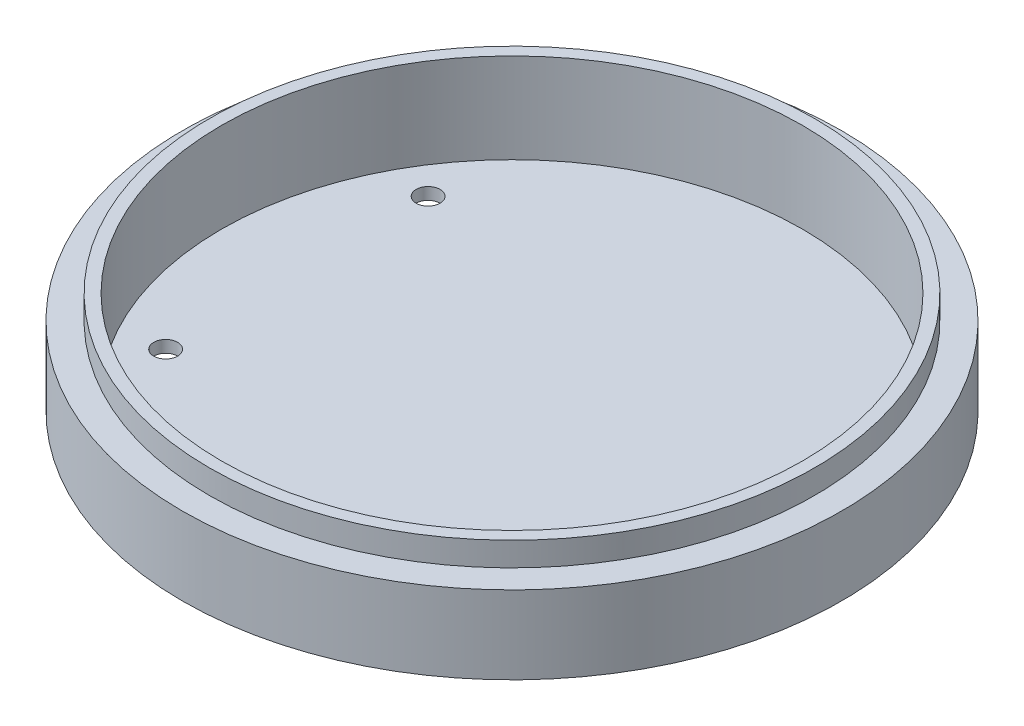
ISO-10303-21;
HEADER;
FILE_DESCRIPTION(('STEP AP214'),'2;1');
FILE_NAME('part.step','',(''),(''),'','','');
FILE_SCHEMA(('AUTOMOTIVE_DESIGN { 1 0 10303 214 1 1 1 1 }'));
ENDSEC;
DATA;
#1=APPLICATION_CONTEXT('core data for automotive mechanical design processes');
#2=APPLICATION_PROTOCOL_DEFINITION('international standard','automotive_design',2000,#1);
#3=PRODUCT_CONTEXT('',#1,'mechanical');
#4=PRODUCT('Part','Part','',(#3));
#5=PRODUCT_RELATED_PRODUCT_CATEGORY('part','',(#4));
#6=PRODUCT_DEFINITION_FORMATION('','',#4);
#7=PRODUCT_DEFINITION_CONTEXT('part definition',#1,'design');
#8=PRODUCT_DEFINITION('design','',#6,#7);
#9=PRODUCT_DEFINITION_SHAPE('','',#8);
#10=(LENGTH_UNIT() NAMED_UNIT(*) SI_UNIT(.MILLI.,.METRE.));
#11=(NAMED_UNIT(*) PLANE_ANGLE_UNIT() SI_UNIT($,.RADIAN.));
#12=(NAMED_UNIT(*) SI_UNIT($,.STERADIAN.) SOLID_ANGLE_UNIT());
#13=UNCERTAINTY_MEASURE_WITH_UNIT(LENGTH_MEASURE(1.E-05),#10,'distance_accuracy_value','');
#14=(GEOMETRIC_REPRESENTATION_CONTEXT(3) GLOBAL_UNCERTAINTY_ASSIGNED_CONTEXT((#13)) GLOBAL_UNIT_ASSIGNED_CONTEXT((#10,
#11,#12)) REPRESENTATION_CONTEXT('',''));
#15=CARTESIAN_POINT('',(0.,0.,0.));
#16=DIRECTION('',(0.,0.,1.));
#17=DIRECTION('',(1.,0.,0.));
#18=AXIS2_PLACEMENT_3D('',#15,#16,#17);
#19=CARTESIAN_POINT('',(0.,13.,0.));
#20=DIRECTION('',(0.,-1.,0.));
#21=DIRECTION('',(0.,0.,-1.));
#22=AXIS2_PLACEMENT_3D('',#19,#20,#21);
#23=CYLINDRICAL_SURFACE('',#22,55.);
#24=CARTESIAN_POINT('',(0.,13.,0.));
#25=DIRECTION('',(0.,1.,0.));
#26=DIRECTION('',(0.,0.,1.));
#27=AXIS2_PLACEMENT_3D('',#24,#25,#26);
#28=CIRCLE('',#27,55.);
#29=CARTESIAN_POINT('',(0.,13.,-55.));
#30=VERTEX_POINT('',#29);
#31=EDGE_CURVE('E45',#30,#30,#28,.T.);
#32=CARTESIAN_POINT('',(0.,0.,0.));
#33=DIRECTION('',(0.,1.,0.));
#34=DIRECTION('',(0.,0.,1.));
#35=AXIS2_PLACEMENT_3D('',#32,#33,#34);
#36=CIRCLE('',#35,55.);
#37=CARTESIAN_POINT('',(0.,0.,-55.));
#38=VERTEX_POINT('',#37);
#39=EDGE_CURVE('E40',#38,#38,#36,.T.);
#40=CARTESIAN_POINT('',(0.,13.,-55.));
#41=CARTESIAN_POINT('',(0.,12.8645833333333,-55.));
#42=CARTESIAN_POINT('',(0.,12.7291666666667,-55.));
#43=CARTESIAN_POINT('',(0.,12.4583333333333,-55.));
#44=CARTESIAN_POINT('',(0.,12.3229166666667,-55.));
#45=CARTESIAN_POINT('',(0.,12.0520833333333,-55.));
#46=CARTESIAN_POINT('',(0.,11.9166666666667,-55.));
#47=CARTESIAN_POINT('',(0.,11.6458333333333,-55.));
#48=CARTESIAN_POINT('',(0.,11.5104166666667,-55.));
#49=CARTESIAN_POINT('',(0.,11.2395833333333,-55.));
#50=CARTESIAN_POINT('',(0.,11.1041666666667,-55.));
#51=CARTESIAN_POINT('',(0.,10.8333333333333,-55.));
#52=CARTESIAN_POINT('',(0.,10.6979166666667,-55.));
#53=CARTESIAN_POINT('',(0.,10.4270833333333,-55.));
#54=CARTESIAN_POINT('',(0.,10.2916666666667,-55.));
#55=CARTESIAN_POINT('',(0.,10.0208333333333,-55.));
#56=CARTESIAN_POINT('',(0.,9.88541666666667,-55.));
#57=CARTESIAN_POINT('',(0.,9.61458333333333,-55.));
#58=CARTESIAN_POINT('',(0.,9.47916666666667,-55.));
#59=CARTESIAN_POINT('',(0.,9.20833333333333,-55.));
#60=CARTESIAN_POINT('',(0.,9.07291666666667,-55.));
#61=CARTESIAN_POINT('',(0.,8.80208333333333,-55.));
#62=CARTESIAN_POINT('',(0.,8.66666666666667,-55.));
#63=CARTESIAN_POINT('',(0.,8.39583333333333,-55.));
#64=CARTESIAN_POINT('',(0.,8.26041666666667,-55.));
#65=CARTESIAN_POINT('',(0.,7.98958333333333,-55.));
#66=CARTESIAN_POINT('',(0.,7.85416666666667,-55.));
#67=CARTESIAN_POINT('',(0.,7.58333333333333,-55.));
#68=CARTESIAN_POINT('',(0.,7.44791666666667,-55.));
#69=CARTESIAN_POINT('',(0.,7.17708333333333,-55.));
#70=CARTESIAN_POINT('',(0.,7.04166666666667,-55.));
#71=CARTESIAN_POINT('',(0.,6.77083333333333,-55.));
#72=CARTESIAN_POINT('',(0.,6.63541666666667,-55.));
#73=CARTESIAN_POINT('',(0.,6.36458333333333,-55.));
#74=CARTESIAN_POINT('',(0.,6.22916666666667,-55.));
#75=CARTESIAN_POINT('',(0.,5.95833333333333,-55.));
#76=CARTESIAN_POINT('',(0.,5.82291666666667,-55.));
#77=CARTESIAN_POINT('',(0.,5.55208333333333,-55.));
#78=CARTESIAN_POINT('',(0.,5.41666666666667,-55.));
#79=CARTESIAN_POINT('',(0.,5.14583333333333,-55.));
#80=CARTESIAN_POINT('',(0.,5.01041666666667,-55.));
#81=CARTESIAN_POINT('',(0.,4.73958333333333,-55.));
#82=CARTESIAN_POINT('',(0.,4.60416666666667,-55.));
#83=CARTESIAN_POINT('',(0.,4.33333333333333,-55.));
#84=CARTESIAN_POINT('',(0.,4.19791666666667,-55.));
#85=CARTESIAN_POINT('',(0.,3.92708333333333,-55.));
#86=CARTESIAN_POINT('',(0.,3.79166666666667,-55.));
#87=CARTESIAN_POINT('',(0.,3.52083333333333,-55.));
#88=CARTESIAN_POINT('',(0.,3.38541666666667,-55.));
#89=CARTESIAN_POINT('',(0.,3.11458333333333,-55.));
#90=CARTESIAN_POINT('',(0.,2.97916666666667,-55.));
#91=CARTESIAN_POINT('',(0.,2.70833333333333,-55.));
#92=CARTESIAN_POINT('',(0.,2.57291666666667,-55.));
#93=CARTESIAN_POINT('',(0.,2.30208333333333,-55.));
#94=CARTESIAN_POINT('',(0.,2.16666666666667,-55.));
#95=CARTESIAN_POINT('',(0.,1.89583333333333,-55.));
#96=CARTESIAN_POINT('',(0.,1.76041666666667,-55.));
#97=CARTESIAN_POINT('',(0.,1.48958333333333,-55.));
#98=CARTESIAN_POINT('',(0.,1.35416666666667,-55.));
#99=CARTESIAN_POINT('',(0.,1.08333333333333,-55.));
#100=CARTESIAN_POINT('',(0.,0.947916666666667,-55.));
#101=CARTESIAN_POINT('',(0.,0.677083333333334,-55.));
#102=CARTESIAN_POINT('',(0.,0.541666666666667,-55.));
#103=CARTESIAN_POINT('',(0.,0.270833333333334,-55.));
#104=CARTESIAN_POINT('',(0.,0.135416666666667,-55.));
#105=CARTESIAN_POINT('',(0.,0.,-55.));
#106=B_SPLINE_CURVE_WITH_KNOTS('',3,(#40,#41,#42,#43,#44,#45,#46,#47,#48,#49,#50,#51,#52,#53,
#54,#55,#56,#57,#58,#59,#60,#61,#62,#63,#64,#65,#66,#67,#68,#69,#70,#71,#72,#73,#74,#75,#76,#77,
#78,#79,#80,#81,#82,#83,#84,#85,#86,#87,#88,#89,#90,#91,#92,#93,#94,#95,#96,#97,#98,#99,#100,
#101,#102,#103,#104,#105),.UNSPECIFIED.,.F.,.F.,(4,2,2,2,2,2,2,2,2,2,2,2,2,2,2,2,2,2,2,2,2,2,2,
2,2,2,2,2,2,2,2,2,4),(0.,0.406249999999999,0.812499999999999,1.21875,1.625,2.03125,2.4375,
2.84375,3.25,3.65625,4.0625,4.46875,4.875,5.28125,5.6875,6.09375,6.5,6.90625,7.3125,7.71875,
8.125,8.53125,8.9375,9.34375,9.75,10.15625,10.5625,10.96875,11.375,11.78125,12.1875,12.59375,
13.),.UNSPECIFIED.);
#107=EDGE_CURVE('BSEAM37',#30,#38,#106,.T.);
#108=ORIENTED_EDGE('',*,*,#31,.F.);
#109=ORIENTED_EDGE('',*,*,#39,.T.);
#110=ORIENTED_EDGE('',*,*,#107,.T.);
#111=ORIENTED_EDGE('',*,*,#107,.F.);
#112=EDGE_LOOP('',(#108,#110,#109,#111));
#113=FACE_BOUND('',#112,.T.);
#114=ADVANCED_FACE('F37',(#113),#23,.T.);
#115=CARTESIAN_POINT('',(0.,13.,0.));
#116=DIRECTION('',(0.,1.,0.));
#117=DIRECTION('',(0.,0.,1.));
#118=AXIS2_PLACEMENT_3D('',#115,#116,#117);
#119=PLANE('',#118);
#120=CARTESIAN_POINT('',(0.,13.,0.));
#121=DIRECTION('',(0.,1.,0.));
#122=DIRECTION('',(0.,0.,1.));
#123=AXIS2_PLACEMENT_3D('',#120,#121,#122);
#124=CIRCLE('',#123,50.5);
#125=CARTESIAN_POINT('',(0.,13.,50.5));
#126=VERTEX_POINT('',#125);
#127=EDGE_CURVE('E10',#126,#126,#124,.T.);
#128=ORIENTED_EDGE('',*,*,#127,.F.);
#129=EDGE_LOOP('',(#128));
#130=FACE_BOUND('',#129,.T.);
#131=ORIENTED_EDGE('',*,*,#31,.T.);
#132=EDGE_LOOP('',(#131));
#133=FACE_BOUND('',#132,.T.);
#134=ADVANCED_FACE('F129',(#130,#133),#119,.T.);
#135=CARTESIAN_POINT('',(0.,0.,0.));
#136=DIRECTION('',(0.,1.,0.));
#137=DIRECTION('',(0.,0.,1.));
#138=AXIS2_PLACEMENT_3D('',#135,#136,#137);
#139=PLANE('',#138);
#140=CARTESIAN_POINT('',(36.,0.,-22.));
#141=DIRECTION('',(0.,1.,0.));
#142=DIRECTION('',(0.,0.,1.));
#143=AXIS2_PLACEMENT_3D('',#140,#141,#142);
#144=CIRCLE('',#143,2.);
#145=CARTESIAN_POINT('',(36.,0.,-20.));
#146=VERTEX_POINT('',#145);
#147=EDGE_CURVE('E61',#146,#146,#144,.T.);
#148=ORIENTED_EDGE('',*,*,#147,.T.);
#149=EDGE_LOOP('',(#148));
#150=FACE_BOUND('',#149,.T.);
#151=CARTESIAN_POINT('',(-35.8,0.,22.));
#152=DIRECTION('',(0.,1.,0.));
#153=DIRECTION('',(0.,0.,1.));
#154=AXIS2_PLACEMENT_3D('',#151,#152,#153);
#155=CIRCLE('',#154,2.);
#156=CARTESIAN_POINT('',(-35.8,0.,24.));
#157=VERTEX_POINT('',#156);
#158=EDGE_CURVE('E68',#157,#157,#155,.T.);
#159=ORIENTED_EDGE('',*,*,#158,.T.);
#160=EDGE_LOOP('',(#159));
#161=FACE_BOUND('',#160,.T.);
#162=CARTESIAN_POINT('',(-36.,0.,-22.));
#163=DIRECTION('',(0.,1.,0.));
#164=DIRECTION('',(0.,0.,1.));
#165=AXIS2_PLACEMENT_3D('',#162,#163,#164);
#166=CIRCLE('',#165,2.);
#167=CARTESIAN_POINT('',(-36.,0.,-20.));
#168=VERTEX_POINT('',#167);
#169=EDGE_CURVE('E72',#168,#168,#166,.T.);
#170=ORIENTED_EDGE('',*,*,#169,.T.);
#171=EDGE_LOOP('',(#170));
#172=FACE_BOUND('',#171,.T.);
#173=CARTESIAN_POINT('',(36.,0.,22.));
#174=DIRECTION('',(0.,1.,0.));
#175=DIRECTION('',(0.,0.,1.));
#176=AXIS2_PLACEMENT_3D('',#173,#174,#175);
#177=CIRCLE('',#176,2.);
#178=CARTESIAN_POINT('',(36.,0.,24.));
#179=VERTEX_POINT('',#178);
#180=EDGE_CURVE('E76',#179,#179,#177,.T.);
#181=ORIENTED_EDGE('',*,*,#180,.T.);
#182=EDGE_LOOP('',(#181));
#183=FACE_BOUND('',#182,.T.);
#184=ORIENTED_EDGE('',*,*,#39,.F.);
#185=EDGE_LOOP('',(#184));
#186=FACE_BOUND('',#185,.T.);
#187=ADVANCED_FACE('F124',(#150,#161,#172,#183,#186),#139,.F.);
#188=CARTESIAN_POINT('',(0.,17.,0.));
#189=DIRECTION('',(0.,-1.,0.));
#190=DIRECTION('',(0.,0.,-1.));
#191=AXIS2_PLACEMENT_3D('',#188,#189,#190);
#192=CYLINDRICAL_SURFACE('',#191,50.5);
#193=CARTESIAN_POINT('',(0.,17.,0.));
#194=DIRECTION('',(0.,1.,0.));
#195=DIRECTION('',(0.,0.,1.));
#196=AXIS2_PLACEMENT_3D('',#193,#194,#195);
#197=CIRCLE('',#196,50.5);
#198=CARTESIAN_POINT('',(0.,17.,50.5));
#199=VERTEX_POINT('',#198);
#200=EDGE_CURVE('E52',#199,#199,#197,.T.);
#201=ORIENTED_EDGE('',*,*,#200,.F.);
#202=EDGE_LOOP('',(#201));
#203=FACE_BOUND('',#202,.T.);
#204=ORIENTED_EDGE('',*,*,#127,.T.);
#205=EDGE_LOOP('',(#204));
#206=FACE_BOUND('',#205,.T.);
#207=ADVANCED_FACE('F119',(#203,#206),#192,.T.);
#208=CARTESIAN_POINT('',(0.,17.,0.));
#209=DIRECTION('',(0.,1.,0.));
#210=DIRECTION('',(0.,0.,1.));
#211=AXIS2_PLACEMENT_3D('',#208,#209,#210);
#212=PLANE('',#211);
#213=CARTESIAN_POINT('',(0.,17.,0.));
#214=DIRECTION('',(0.,1.,0.));
#215=DIRECTION('',(0.,0.,1.));
#216=AXIS2_PLACEMENT_3D('',#213,#214,#215);
#217=CIRCLE('',#216,48.5);
#218=CARTESIAN_POINT('',(0.,17.,48.5));
#219=VERTEX_POINT('',#218);
#220=EDGE_CURVE('E57',#219,#219,#217,.T.);
#221=ORIENTED_EDGE('',*,*,#220,.F.);
#222=EDGE_LOOP('',(#221));
#223=FACE_BOUND('',#222,.T.);
#224=ORIENTED_EDGE('',*,*,#200,.T.);
#225=EDGE_LOOP('',(#224));
#226=FACE_BOUND('',#225,.T.);
#227=ADVANCED_FACE('F113',(#223,#226),#212,.T.);
#228=CARTESIAN_POINT('',(0.,2.,0.));
#229=DIRECTION('',(0.,1.,0.));
#230=DIRECTION('',(0.,0.,1.));
#231=AXIS2_PLACEMENT_3D('',#228,#229,#230);
#232=CYLINDRICAL_SURFACE('',#231,48.5);
#233=CARTESIAN_POINT('',(0.,2.,0.));
#234=DIRECTION('',(0.,1.,0.));
#235=DIRECTION('',(0.,0.,1.));
#236=AXIS2_PLACEMENT_3D('',#233,#234,#235);
#237=CIRCLE('',#236,48.5);
#238=CARTESIAN_POINT('',(0.,2.,48.5));
#239=VERTEX_POINT('',#238);
#240=EDGE_CURVE('E56',#239,#239,#237,.T.);
#241=ORIENTED_EDGE('',*,*,#240,.F.);
#242=EDGE_LOOP('',(#241));
#243=FACE_BOUND('',#242,.T.);
#244=ORIENTED_EDGE('',*,*,#220,.T.);
#245=EDGE_LOOP('',(#244));
#246=FACE_BOUND('',#245,.T.);
#247=ADVANCED_FACE('F104',(#243,#246),#232,.F.);
#248=CARTESIAN_POINT('',(0.,2.,0.));
#249=DIRECTION('',(0.,1.,0.));
#250=DIRECTION('',(0.,0.,1.));
#251=AXIS2_PLACEMENT_3D('',#248,#249,#250);
#252=PLANE('',#251);
#253=CARTESIAN_POINT('',(36.,2.,-22.));
#254=DIRECTION('',(0.,1.,0.));
#255=DIRECTION('',(0.,0.,1.));
#256=AXIS2_PLACEMENT_3D('',#253,#254,#255);
#257=CIRCLE('',#256,2.);
#258=CARTESIAN_POINT('',(36.,2.,-20.));
#259=VERTEX_POINT('',#258);
#260=EDGE_CURVE('E85',#259,#259,#257,.T.);
#261=ORIENTED_EDGE('',*,*,#260,.F.);
#262=EDGE_LOOP('',(#261));
#263=FACE_BOUND('',#262,.T.);
#264=CARTESIAN_POINT('',(-35.8,2.,22.));
#265=DIRECTION('',(0.,1.,0.));
#266=DIRECTION('',(0.,0.,1.));
#267=AXIS2_PLACEMENT_3D('',#264,#265,#266);
#268=CIRCLE('',#267,2.);
#269=CARTESIAN_POINT('',(-35.8,2.,24.));
#270=VERTEX_POINT('',#269);
#271=EDGE_CURVE('E89',#270,#270,#268,.T.);
#272=ORIENTED_EDGE('',*,*,#271,.F.);
#273=EDGE_LOOP('',(#272));
#274=FACE_BOUND('',#273,.T.);
#275=CARTESIAN_POINT('',(-36.,2.,-22.));
#276=DIRECTION('',(0.,1.,0.));
#277=DIRECTION('',(0.,0.,1.));
#278=AXIS2_PLACEMENT_3D('',#275,#276,#277);
#279=CIRCLE('',#278,2.);
#280=CARTESIAN_POINT('',(-36.,2.,-20.));
#281=VERTEX_POINT('',#280);
#282=EDGE_CURVE('E84',#281,#281,#279,.T.);
#283=ORIENTED_EDGE('',*,*,#282,.F.);
#284=EDGE_LOOP('',(#283));
#285=FACE_BOUND('',#284,.T.);
#286=CARTESIAN_POINT('',(36.,2.,22.));
#287=DIRECTION('',(0.,1.,0.));
#288=DIRECTION('',(0.,0.,1.));
#289=AXIS2_PLACEMENT_3D('',#286,#287,#288);
#290=CIRCLE('',#289,2.);
#291=CARTESIAN_POINT('',(36.,2.,24.));
#292=VERTEX_POINT('',#291);
#293=EDGE_CURVE('E80',#292,#292,#290,.T.);
#294=ORIENTED_EDGE('',*,*,#293,.F.);
#295=EDGE_LOOP('',(#294));
#296=FACE_BOUND('',#295,.T.);
#297=ORIENTED_EDGE('',*,*,#240,.T.);
#298=EDGE_LOOP('',(#297));
#299=FACE_BOUND('',#298,.T.);
#300=ADVANCED_FACE('F100',(#263,#274,#285,#296,#299),#252,.T.);
#301=CARTESIAN_POINT('',(36.,-13.,22.));
#302=DIRECTION('',(0.,1.,0.));
#303=DIRECTION('',(0.,0.,1.));
#304=AXIS2_PLACEMENT_3D('',#301,#302,#303);
#305=CYLINDRICAL_SURFACE('',#304,2.);
#306=ORIENTED_EDGE('',*,*,#293,.T.);
#307=EDGE_LOOP('',(#306));
#308=FACE_BOUND('',#307,.T.);
#309=ORIENTED_EDGE('',*,*,#180,.F.);
#310=EDGE_LOOP('',(#309));
#311=FACE_BOUND('',#310,.T.);
#312=ADVANCED_FACE('F103',(#308,#311),#305,.F.);
#313=CARTESIAN_POINT('',(-36.,-13.,-22.));
#314=DIRECTION('',(0.,1.,0.));
#315=DIRECTION('',(0.,0.,1.));
#316=AXIS2_PLACEMENT_3D('',#313,#314,#315);
#317=CYLINDRICAL_SURFACE('',#316,2.);
#318=ORIENTED_EDGE('',*,*,#282,.T.);
#319=EDGE_LOOP('',(#318));
#320=FACE_BOUND('',#319,.T.);
#321=ORIENTED_EDGE('',*,*,#169,.F.);
#322=EDGE_LOOP('',(#321));
#323=FACE_BOUND('',#322,.T.);
#324=ADVANCED_FACE('F97',(#320,#323),#317,.F.);
#325=CARTESIAN_POINT('',(-35.8,-13.,22.));
#326=DIRECTION('',(0.,1.,0.));
#327=DIRECTION('',(0.,0.,1.));
#328=AXIS2_PLACEMENT_3D('',#325,#326,#327);
#329=CYLINDRICAL_SURFACE('',#328,2.);
#330=ORIENTED_EDGE('',*,*,#271,.T.);
#331=EDGE_LOOP('',(#330));
#332=FACE_BOUND('',#331,.T.);
#333=ORIENTED_EDGE('',*,*,#158,.F.);
#334=EDGE_LOOP('',(#333));
#335=FACE_BOUND('',#334,.T.);
#336=ADVANCED_FACE('F180',(#332,#335),#329,.F.);
#337=CARTESIAN_POINT('',(36.,-13.,-22.));
#338=DIRECTION('',(0.,1.,0.));
#339=DIRECTION('',(0.,0.,1.));
#340=AXIS2_PLACEMENT_3D('',#337,#338,#339);
#341=CYLINDRICAL_SURFACE('',#340,2.);
#342=ORIENTED_EDGE('',*,*,#260,.T.);
#343=EDGE_LOOP('',(#342));
#344=FACE_BOUND('',#343,.T.);
#345=ORIENTED_EDGE('',*,*,#147,.F.);
#346=EDGE_LOOP('',(#345));
#347=FACE_BOUND('',#346,.T.);
#348=ADVANCED_FACE('F189',(#344,#347),#341,.F.);
#349=CLOSED_SHELL('',(#114,#134,#187,#207,#227,#247,#300,#312,#324,#336,#348));
#350=MANIFOLD_SOLID_BREP('B2',#349);
#351=ADVANCED_BREP_SHAPE_REPRESENTATION('',(#18,#350),#14);
#352=SHAPE_DEFINITION_REPRESENTATION(#9,#351);
ENDSEC;
END-ISO-10303-21;
